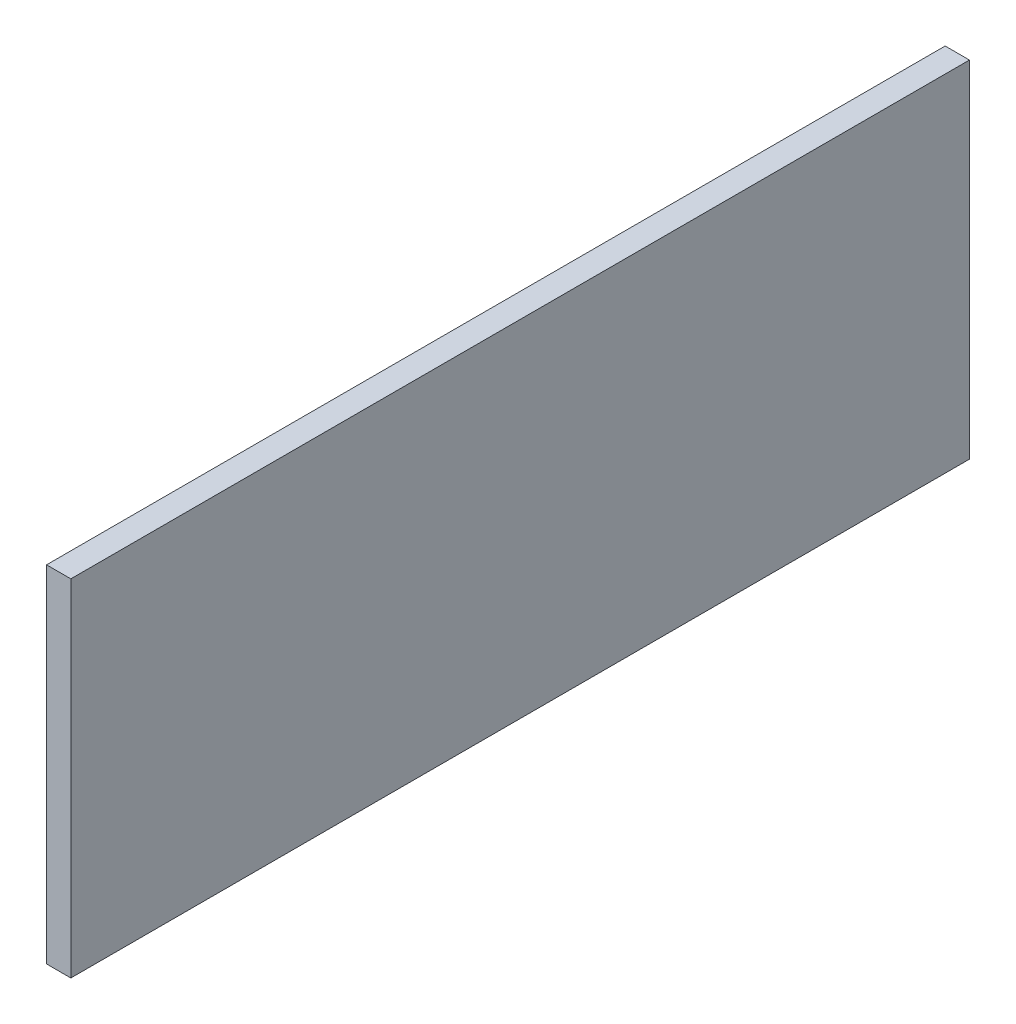
ISO-10303-21;
HEADER;
FILE_DESCRIPTION(('STEP AP214'),'2;1');
FILE_NAME('part.step','',(''),(''),'','','');
FILE_SCHEMA(('AUTOMOTIVE_DESIGN { 1 0 10303 214 1 1 1 1 }'));
ENDSEC;
DATA;
#1=APPLICATION_CONTEXT('core data for automotive mechanical design processes');
#2=APPLICATION_PROTOCOL_DEFINITION('international standard','automotive_design',2000,#1);
#3=PRODUCT_CONTEXT('',#1,'mechanical');
#4=PRODUCT('Part','Part','',(#3));
#5=PRODUCT_RELATED_PRODUCT_CATEGORY('part','',(#4));
#6=PRODUCT_DEFINITION_FORMATION('','',#4);
#7=PRODUCT_DEFINITION_CONTEXT('part definition',#1,'design');
#8=PRODUCT_DEFINITION('design','',#6,#7);
#9=PRODUCT_DEFINITION_SHAPE('','',#8);
#10=(LENGTH_UNIT() NAMED_UNIT(*) SI_UNIT(.MILLI.,.METRE.));
#11=(NAMED_UNIT(*) PLANE_ANGLE_UNIT() SI_UNIT($,.RADIAN.));
#12=(NAMED_UNIT(*) SI_UNIT($,.STERADIAN.) SOLID_ANGLE_UNIT());
#13=UNCERTAINTY_MEASURE_WITH_UNIT(LENGTH_MEASURE(1.E-05),#10,'distance_accuracy_value','');
#14=(GEOMETRIC_REPRESENTATION_CONTEXT(3) GLOBAL_UNCERTAINTY_ASSIGNED_CONTEXT((#13)) GLOBAL_UNIT_ASSIGNED_CONTEXT((#10,
#11,#12)) REPRESENTATION_CONTEXT('',''));
#15=CARTESIAN_POINT('',(0.,0.,0.));
#16=DIRECTION('',(0.,0.,1.));
#17=DIRECTION('',(1.,0.,0.));
#18=AXIS2_PLACEMENT_3D('',#15,#16,#17);
#19=CARTESIAN_POINT('',(6.,0.,0.));
#20=DIRECTION('',(0.,0.,-1.));
#21=DIRECTION('',(-1.,0.,0.));
#22=AXIS2_PLACEMENT_3D('',#19,#20,#21);
#23=PLANE('',#22);
#24=DIRECTION('',(0.,-1.,0.));
#25=VECTOR('',#24,1.);
#26=CARTESIAN_POINT('',(0.,0.,0.));
#27=LINE('',#26,#25);
#28=CARTESIAN_POINT('',(0.,85.4,0.));
#29=VERTEX_POINT('',#28);
#30=CARTESIAN_POINT('',(0.,0.,0.));
#31=VERTEX_POINT('',#30);
#32=EDGE_CURVE('E99',#29,#31,#27,.T.);
#33=ORIENTED_EDGE('',*,*,#32,.T.);
#34=DIRECTION('',(-1.,0.,0.));
#35=VECTOR('',#34,1.);
#36=CARTESIAN_POINT('',(6.,0.,0.));
#37=LINE('',#36,#35);
#38=CARTESIAN_POINT('',(6.,0.,0.));
#39=VERTEX_POINT('',#38);
#40=EDGE_CURVE('E11',#39,#31,#37,.T.);
#41=ORIENTED_EDGE('',*,*,#40,.F.);
#42=DIRECTION('',(0.,-1.,0.));
#43=VECTOR('',#42,1.);
#44=CARTESIAN_POINT('',(6.,0.,0.));
#45=LINE('',#44,#43);
#46=CARTESIAN_POINT('',(6.,85.4,0.));
#47=VERTEX_POINT('',#46);
#48=EDGE_CURVE('E87',#47,#39,#45,.T.);
#49=ORIENTED_EDGE('',*,*,#48,.F.);
#50=DIRECTION('',(-1.,0.,0.));
#51=VECTOR('',#50,1.);
#52=CARTESIAN_POINT('',(6.,85.4,0.));
#53=LINE('',#52,#51);
#54=EDGE_CURVE('E95',#47,#29,#53,.T.);
#55=ORIENTED_EDGE('',*,*,#54,.T.);
#56=EDGE_LOOP('',(#33,#41,#49,#55));
#57=FACE_BOUND('',#56,.T.);
#58=ADVANCED_FACE('F36',(#57),#23,.F.);
#59=CARTESIAN_POINT('',(6.,0.,0.));
#60=DIRECTION('',(0.,1.,0.));
#61=DIRECTION('',(0.,0.,1.));
#62=AXIS2_PLACEMENT_3D('',#59,#60,#61);
#63=PLANE('',#62);
#64=DIRECTION('',(0.,0.,-1.));
#65=VECTOR('',#64,1.);
#66=CARTESIAN_POINT('',(0.,0.,0.));
#67=LINE('',#66,#65);
#68=CARTESIAN_POINT('',(0.,0.,-222.));
#69=VERTEX_POINT('',#68);
#70=EDGE_CURVE('E91',#31,#69,#67,.T.);
#71=ORIENTED_EDGE('',*,*,#70,.T.);
#72=DIRECTION('',(-1.,0.,0.));
#73=VECTOR('',#72,1.);
#74=CARTESIAN_POINT('',(6.,0.,-222.));
#75=LINE('',#74,#73);
#76=CARTESIAN_POINT('',(6.,0.,-222.));
#77=VERTEX_POINT('',#76);
#78=EDGE_CURVE('E44',#77,#69,#75,.T.);
#79=ORIENTED_EDGE('',*,*,#78,.F.);
#80=DIRECTION('',(0.,0.,-1.));
#81=VECTOR('',#80,1.);
#82=CARTESIAN_POINT('',(6.,0.,0.));
#83=LINE('',#82,#81);
#84=EDGE_CURVE('E82',#39,#77,#83,.T.);
#85=ORIENTED_EDGE('',*,*,#84,.F.);
#86=ORIENTED_EDGE('',*,*,#40,.T.);
#87=EDGE_LOOP('',(#71,#79,#85,#86));
#88=FACE_BOUND('',#87,.T.);
#89=ADVANCED_FACE('F90',(#88),#63,.F.);
#90=CARTESIAN_POINT('',(6.,0.,-222.));
#91=DIRECTION('',(0.,0.,1.));
#92=DIRECTION('',(1.,0.,0.));
#93=AXIS2_PLACEMENT_3D('',#90,#91,#92);
#94=PLANE('',#93);
#95=DIRECTION('',(0.,1.,0.));
#96=VECTOR('',#95,1.);
#97=CARTESIAN_POINT('',(0.,0.,-222.));
#98=LINE('',#97,#96);
#99=CARTESIAN_POINT('',(0.,85.4,-222.));
#100=VERTEX_POINT('',#99);
#101=EDGE_CURVE('E69',#69,#100,#98,.T.);
#102=ORIENTED_EDGE('',*,*,#101,.T.);
#103=DIRECTION('',(-1.,0.,0.));
#104=VECTOR('',#103,1.);
#105=CARTESIAN_POINT('',(6.,85.4,-222.));
#106=LINE('',#105,#104);
#107=CARTESIAN_POINT('',(6.,85.4,-222.));
#108=VERTEX_POINT('',#107);
#109=EDGE_CURVE('E92',#108,#100,#106,.T.);
#110=ORIENTED_EDGE('',*,*,#109,.F.);
#111=DIRECTION('',(0.,1.,0.));
#112=VECTOR('',#111,1.);
#113=CARTESIAN_POINT('',(6.,0.,-222.));
#114=LINE('',#113,#112);
#115=EDGE_CURVE('E85',#77,#108,#114,.T.);
#116=ORIENTED_EDGE('',*,*,#115,.F.);
#117=ORIENTED_EDGE('',*,*,#78,.T.);
#118=EDGE_LOOP('',(#102,#110,#116,#117));
#119=FACE_BOUND('',#118,.T.);
#120=ADVANCED_FACE('F93',(#119),#94,.F.);
#121=CARTESIAN_POINT('',(6.,85.4,0.));
#122=DIRECTION('',(0.,-1.,0.));
#123=DIRECTION('',(0.,0.,-1.));
#124=AXIS2_PLACEMENT_3D('',#121,#122,#123);
#125=PLANE('',#124);
#126=DIRECTION('',(0.,0.,1.));
#127=VECTOR('',#126,1.);
#128=CARTESIAN_POINT('',(0.,85.4,0.));
#129=LINE('',#128,#127);
#130=EDGE_CURVE('E75',#100,#29,#129,.T.);
#131=ORIENTED_EDGE('',*,*,#130,.T.);
#132=ORIENTED_EDGE('',*,*,#54,.F.);
#133=DIRECTION('',(0.,0.,1.));
#134=VECTOR('',#133,1.);
#135=CARTESIAN_POINT('',(6.,85.4,0.));
#136=LINE('',#135,#134);
#137=EDGE_CURVE('E52',#108,#47,#136,.T.);
#138=ORIENTED_EDGE('',*,*,#137,.F.);
#139=ORIENTED_EDGE('',*,*,#109,.T.);
#140=EDGE_LOOP('',(#131,#132,#138,#139));
#141=FACE_BOUND('',#140,.T.);
#142=ADVANCED_FACE('F106',(#141),#125,.F.);
#143=CARTESIAN_POINT('',(6.,0.,0.));
#144=DIRECTION('',(-1.,0.,0.));
#145=DIRECTION('',(0.,0.,1.));
#146=AXIS2_PLACEMENT_3D('',#143,#144,#145);
#147=PLANE('',#146);
#148=ORIENTED_EDGE('',*,*,#48,.T.);
#149=ORIENTED_EDGE('',*,*,#84,.T.);
#150=ORIENTED_EDGE('',*,*,#115,.T.);
#151=ORIENTED_EDGE('',*,*,#137,.T.);
#152=EDGE_LOOP('',(#148,#149,#150,#151));
#153=FACE_BOUND('',#152,.T.);
#154=ADVANCED_FACE('F83',(#153),#147,.F.);
#155=CARTESIAN_POINT('',(0.,0.,0.));
#156=DIRECTION('',(-1.,0.,0.));
#157=DIRECTION('',(0.,0.,1.));
#158=AXIS2_PLACEMENT_3D('',#155,#156,#157);
#159=PLANE('',#158);
#160=ORIENTED_EDGE('',*,*,#32,.F.);
#161=ORIENTED_EDGE('',*,*,#130,.F.);
#162=ORIENTED_EDGE('',*,*,#101,.F.);
#163=ORIENTED_EDGE('',*,*,#70,.F.);
#164=EDGE_LOOP('',(#160,#161,#162,#163));
#165=FACE_BOUND('',#164,.T.);
#166=ADVANCED_FACE('F109',(#165),#159,.T.);
#167=CLOSED_SHELL('',(#58,#89,#120,#142,#154,#166));
#168=MANIFOLD_SOLID_BREP('B2',#167);
#169=ADVANCED_BREP_SHAPE_REPRESENTATION('',(#18,#168),#14);
#170=SHAPE_DEFINITION_REPRESENTATION(#9,#169);
ENDSEC;
END-ISO-10303-21;
